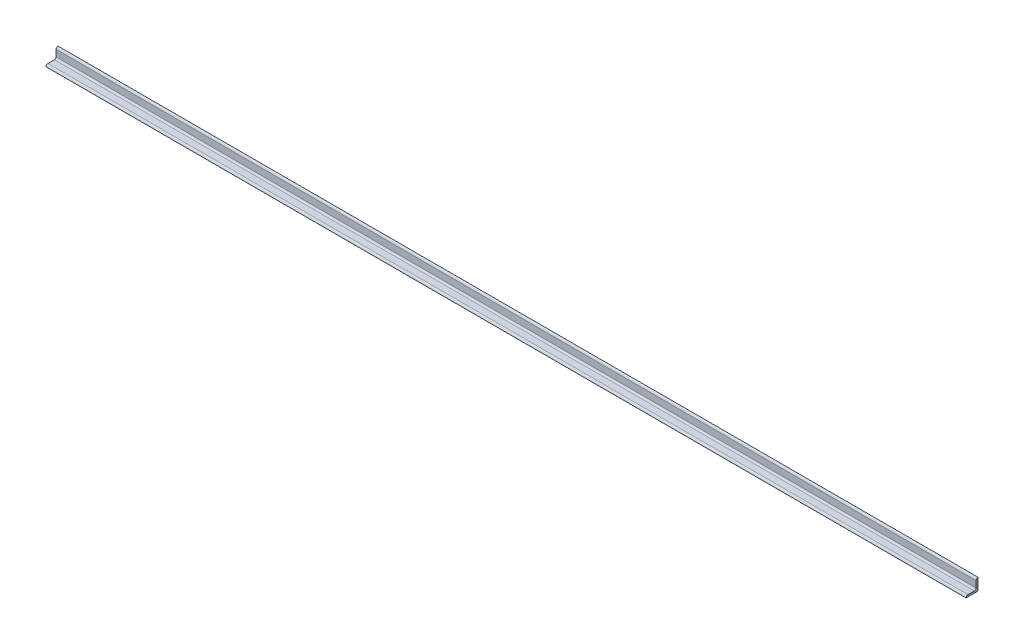
ISO-10303-21;
HEADER;
FILE_DESCRIPTION(('STEP AP214'),'2;1');
FILE_NAME('part.step','',(''),(''),'','','');
FILE_SCHEMA(('AUTOMOTIVE_DESIGN { 1 0 10303 214 1 1 1 1 }'));
ENDSEC;
DATA;
#1=APPLICATION_CONTEXT('core data for automotive mechanical design processes');
#2=APPLICATION_PROTOCOL_DEFINITION('international standard','automotive_design',2000,#1);
#3=PRODUCT_CONTEXT('',#1,'mechanical');
#4=PRODUCT('Part','Part','',(#3));
#5=PRODUCT_RELATED_PRODUCT_CATEGORY('part','',(#4));
#6=PRODUCT_DEFINITION_FORMATION('','',#4);
#7=PRODUCT_DEFINITION_CONTEXT('part definition',#1,'design');
#8=PRODUCT_DEFINITION('design','',#6,#7);
#9=PRODUCT_DEFINITION_SHAPE('','',#8);
#10=(LENGTH_UNIT() NAMED_UNIT(*) SI_UNIT(.MILLI.,.METRE.));
#11=(NAMED_UNIT(*) PLANE_ANGLE_UNIT() SI_UNIT($,.RADIAN.));
#12=(NAMED_UNIT(*) SI_UNIT($,.STERADIAN.) SOLID_ANGLE_UNIT());
#13=UNCERTAINTY_MEASURE_WITH_UNIT(LENGTH_MEASURE(1.E-05),#10,'distance_accuracy_value','');
#14=(GEOMETRIC_REPRESENTATION_CONTEXT(3) GLOBAL_UNCERTAINTY_ASSIGNED_CONTEXT((#13)) GLOBAL_UNIT_ASSIGNED_CONTEXT((#10,
#11,#12)) REPRESENTATION_CONTEXT('',''));
#15=CARTESIAN_POINT('',(0.,0.,0.));
#16=DIRECTION('',(0.,0.,1.));
#17=DIRECTION('',(1.,0.,0.));
#18=AXIS2_PLACEMENT_3D('',#15,#16,#17);
#19=CARTESIAN_POINT('',(960.,25.,0.));
#20=DIRECTION('',(0.,0.,1.));
#21=DIRECTION('',(1.,0.,0.));
#22=AXIS2_PLACEMENT_3D('',#19,#20,#21);
#23=PLANE('',#22);
#24=DIRECTION('',(0.,1.,0.));
#25=VECTOR('',#24,1.);
#26=CARTESIAN_POINT('',(-960.,25.,0.));
#27=LINE('',#26,#25);
#28=CARTESIAN_POINT('',(-960.,0.,0.));
#29=VERTEX_POINT('',#28);
#30=CARTESIAN_POINT('',(-960.,25.,0.));
#31=VERTEX_POINT('',#30);
#32=EDGE_CURVE('E149',#29,#31,#27,.T.);
#33=ORIENTED_EDGE('',*,*,#32,.T.);
#34=DIRECTION('',(-1.,0.,0.));
#35=VECTOR('',#34,1.);
#36=CARTESIAN_POINT('',(960.,25.,0.));
#37=LINE('',#36,#35);
#38=CARTESIAN_POINT('',(960.,25.,0.));
#39=VERTEX_POINT('',#38);
#40=EDGE_CURVE('E13',#39,#31,#37,.T.);
#41=ORIENTED_EDGE('',*,*,#40,.F.);
#42=DIRECTION('',(0.,1.,0.));
#43=VECTOR('',#42,1.);
#44=CARTESIAN_POINT('',(960.,25.,0.));
#45=LINE('',#44,#43);
#46=CARTESIAN_POINT('',(960.,0.,0.));
#47=VERTEX_POINT('',#46);
#48=EDGE_CURVE('E161',#47,#39,#45,.T.);
#49=ORIENTED_EDGE('',*,*,#48,.F.);
#50=DIRECTION('',(-1.,0.,0.));
#51=VECTOR('',#50,1.);
#52=CARTESIAN_POINT('',(960.,0.,0.));
#53=LINE('',#52,#51);
#54=EDGE_CURVE('E145',#47,#29,#53,.T.);
#55=ORIENTED_EDGE('',*,*,#54,.T.);
#56=EDGE_LOOP('',(#33,#41,#49,#55));
#57=FACE_BOUND('',#56,.T.);
#58=ADVANCED_FACE('F59',(#57),#23,.F.);
#59=CARTESIAN_POINT('',(960.,21.,0.));
#60=DIRECTION('',(-1.,0.,0.));
#61=DIRECTION('',(0.,0.,1.));
#62=AXIS2_PLACEMENT_3D('',#59,#60,#61);
#63=CYLINDRICAL_SURFACE('',#62,4.);
#64=CARTESIAN_POINT('',(-960.,21.,0.));
#65=DIRECTION('',(1.,0.,0.));
#66=DIRECTION('',(0.,0.,-1.));
#67=AXIS2_PLACEMENT_3D('',#64,#65,#66);
#68=CIRCLE('',#67,4.);
#69=CARTESIAN_POINT('',(-960.,21.,4.));
#70=VERTEX_POINT('',#69);
#71=EDGE_CURVE('E152',#31,#70,#68,.T.);
#72=ORIENTED_EDGE('',*,*,#71,.T.);
#73=DIRECTION('',(-1.,0.,0.));
#74=VECTOR('',#73,1.);
#75=CARTESIAN_POINT('',(960.,21.,4.));
#76=LINE('',#75,#74);
#77=CARTESIAN_POINT('',(960.,21.,4.));
#78=VERTEX_POINT('',#77);
#79=EDGE_CURVE('E67',#78,#70,#76,.T.);
#80=ORIENTED_EDGE('',*,*,#79,.F.);
#81=CARTESIAN_POINT('',(960.,21.,0.));
#82=DIRECTION('',(1.,0.,0.));
#83=DIRECTION('',(0.,0.,-1.));
#84=AXIS2_PLACEMENT_3D('',#81,#82,#83);
#85=CIRCLE('',#84,4.);
#86=EDGE_CURVE('E115',#39,#78,#85,.T.);
#87=ORIENTED_EDGE('',*,*,#86,.F.);
#88=ORIENTED_EDGE('',*,*,#40,.T.);
#89=EDGE_LOOP('',(#72,#80,#87,#88));
#90=FACE_BOUND('',#89,.T.);
#91=ADVANCED_FACE('F186',(#90),#63,.T.);
#92=CARTESIAN_POINT('',(960.,7.5,4.));
#93=DIRECTION('',(0.,0.,-1.));
#94=DIRECTION('',(0.,1.,0.));
#95=AXIS2_PLACEMENT_3D('',#92,#93,#94);
#96=PLANE('',#95);
#97=DIRECTION('',(0.,-1.,0.));
#98=VECTOR('',#97,1.);
#99=CARTESIAN_POINT('',(-960.,7.5,4.));
#100=LINE('',#99,#98);
#101=CARTESIAN_POINT('',(-960.,7.5,4.));
#102=VERTEX_POINT('',#101);
#103=EDGE_CURVE('E154',#70,#102,#100,.T.);
#104=ORIENTED_EDGE('',*,*,#103,.T.);
#105=DIRECTION('',(-1.,0.,0.));
#106=VECTOR('',#105,1.);
#107=CARTESIAN_POINT('',(960.,7.5,4.));
#108=LINE('',#107,#106);
#109=CARTESIAN_POINT('',(960.,7.5,4.));
#110=VERTEX_POINT('',#109);
#111=EDGE_CURVE('E165',#110,#102,#108,.T.);
#112=ORIENTED_EDGE('',*,*,#111,.F.);
#113=DIRECTION('',(0.,-1.,0.));
#114=VECTOR('',#113,1.);
#115=CARTESIAN_POINT('',(960.,7.5,4.));
#116=LINE('',#115,#114);
#117=EDGE_CURVE('E173',#78,#110,#116,.T.);
#118=ORIENTED_EDGE('',*,*,#117,.F.);
#119=ORIENTED_EDGE('',*,*,#79,.T.);
#120=EDGE_LOOP('',(#104,#112,#118,#119));
#121=FACE_BOUND('',#120,.T.);
#122=ADVANCED_FACE('F171',(#121),#96,.F.);
#123=CARTESIAN_POINT('',(960.,7.5,7.5));
#124=DIRECTION('',(-1.,0.,0.));
#125=DIRECTION('',(0.,0.,1.));
#126=AXIS2_PLACEMENT_3D('',#123,#124,#125);
#127=CYLINDRICAL_SURFACE('',#126,3.5);
#128=CARTESIAN_POINT('',(-960.,7.5,7.5));
#129=DIRECTION('',(-1.,0.,0.));
#130=DIRECTION('',(0.,0.,1.));
#131=AXIS2_PLACEMENT_3D('',#128,#129,#130);
#132=CIRCLE('',#131,3.5);
#133=CARTESIAN_POINT('',(-960.,4.,7.5));
#134=VERTEX_POINT('',#133);
#135=EDGE_CURVE('E156',#102,#134,#132,.T.);
#136=ORIENTED_EDGE('',*,*,#135,.T.);
#137=DIRECTION('',(-1.,0.,0.));
#138=VECTOR('',#137,1.);
#139=CARTESIAN_POINT('',(960.,4.,7.5));
#140=LINE('',#139,#138);
#141=CARTESIAN_POINT('',(960.,4.,7.5));
#142=VERTEX_POINT('',#141);
#143=EDGE_CURVE('E140',#142,#134,#140,.T.);
#144=ORIENTED_EDGE('',*,*,#143,.F.);
#145=CARTESIAN_POINT('',(960.,7.5,7.5));
#146=DIRECTION('',(-1.,0.,0.));
#147=DIRECTION('',(0.,0.,1.));
#148=AXIS2_PLACEMENT_3D('',#145,#146,#147);
#149=CIRCLE('',#148,3.5);
#150=EDGE_CURVE('E131',#110,#142,#149,.T.);
#151=ORIENTED_EDGE('',*,*,#150,.F.);
#152=ORIENTED_EDGE('',*,*,#111,.T.);
#153=EDGE_LOOP('',(#136,#144,#151,#152));
#154=FACE_BOUND('',#153,.T.);
#155=ADVANCED_FACE('F179',(#154),#127,.F.);
#156=CARTESIAN_POINT('',(960.,4.,21.));
#157=DIRECTION('',(0.,-1.,0.));
#158=DIRECTION('',(0.,0.,-1.));
#159=AXIS2_PLACEMENT_3D('',#156,#157,#158);
#160=PLANE('',#159);
#161=DIRECTION('',(0.,0.,1.));
#162=VECTOR('',#161,1.);
#163=CARTESIAN_POINT('',(-960.,4.,21.));
#164=LINE('',#163,#162);
#165=CARTESIAN_POINT('',(-960.,4.,21.));
#166=VERTEX_POINT('',#165);
#167=EDGE_CURVE('E139',#134,#166,#164,.T.);
#168=ORIENTED_EDGE('',*,*,#167,.T.);
#169=DIRECTION('',(-1.,0.,0.));
#170=VECTOR('',#169,1.);
#171=CARTESIAN_POINT('',(960.,4.,21.));
#172=LINE('',#171,#170);
#173=CARTESIAN_POINT('',(960.,4.,21.));
#174=VERTEX_POINT('',#173);
#175=EDGE_CURVE('E136',#174,#166,#172,.T.);
#176=ORIENTED_EDGE('',*,*,#175,.F.);
#177=DIRECTION('',(0.,0.,1.));
#178=VECTOR('',#177,1.);
#179=CARTESIAN_POINT('',(960.,4.,21.));
#180=LINE('',#179,#178);
#181=EDGE_CURVE('E125',#142,#174,#180,.T.);
#182=ORIENTED_EDGE('',*,*,#181,.F.);
#183=ORIENTED_EDGE('',*,*,#143,.T.);
#184=EDGE_LOOP('',(#168,#176,#182,#183));
#185=FACE_BOUND('',#184,.T.);
#186=ADVANCED_FACE('F137',(#185),#160,.F.);
#187=CARTESIAN_POINT('',(960.,0.,21.));
#188=DIRECTION('',(-1.,0.,0.));
#189=DIRECTION('',(0.,0.,1.));
#190=AXIS2_PLACEMENT_3D('',#187,#188,#189);
#191=CYLINDRICAL_SURFACE('',#190,4.);
#192=CARTESIAN_POINT('',(-960.,0.,21.));
#193=DIRECTION('',(1.,0.,0.));
#194=DIRECTION('',(0.,0.,1.));
#195=AXIS2_PLACEMENT_3D('',#192,#193,#194);
#196=CIRCLE('',#195,4.);
#197=CARTESIAN_POINT('',(-960.,0.,25.));
#198=VERTEX_POINT('',#197);
#199=EDGE_CURVE('E101',#166,#198,#196,.T.);
#200=ORIENTED_EDGE('',*,*,#199,.T.);
#201=DIRECTION('',(-1.,0.,0.));
#202=VECTOR('',#201,1.);
#203=CARTESIAN_POINT('',(960.,0.,25.));
#204=LINE('',#203,#202);
#205=CARTESIAN_POINT('',(960.,0.,25.));
#206=VERTEX_POINT('',#205);
#207=EDGE_CURVE('E141',#206,#198,#204,.T.);
#208=ORIENTED_EDGE('',*,*,#207,.F.);
#209=CARTESIAN_POINT('',(960.,0.,21.));
#210=DIRECTION('',(1.,0.,0.));
#211=DIRECTION('',(0.,0.,1.));
#212=AXIS2_PLACEMENT_3D('',#209,#210,#211);
#213=CIRCLE('',#212,4.);
#214=EDGE_CURVE('E129',#174,#206,#213,.T.);
#215=ORIENTED_EDGE('',*,*,#214,.F.);
#216=ORIENTED_EDGE('',*,*,#175,.T.);
#217=EDGE_LOOP('',(#200,#208,#215,#216));
#218=FACE_BOUND('',#217,.T.);
#219=ADVANCED_FACE('F143',(#218),#191,.T.);
#220=CARTESIAN_POINT('',(960.,0.,0.));
#221=DIRECTION('',(0.,1.,0.));
#222=DIRECTION('',(0.,0.,1.));
#223=AXIS2_PLACEMENT_3D('',#220,#221,#222);
#224=PLANE('',#223);
#225=DIRECTION('',(0.,0.,-1.));
#226=VECTOR('',#225,1.);
#227=CARTESIAN_POINT('',(-960.,0.,0.));
#228=LINE('',#227,#226);
#229=EDGE_CURVE('E107',#198,#29,#228,.T.);
#230=ORIENTED_EDGE('',*,*,#229,.T.);
#231=ORIENTED_EDGE('',*,*,#54,.F.);
#232=DIRECTION('',(0.,0.,-1.));
#233=VECTOR('',#232,1.);
#234=CARTESIAN_POINT('',(960.,0.,0.));
#235=LINE('',#234,#233);
#236=EDGE_CURVE('E75',#206,#47,#235,.T.);
#237=ORIENTED_EDGE('',*,*,#236,.F.);
#238=ORIENTED_EDGE('',*,*,#207,.T.);
#239=EDGE_LOOP('',(#230,#231,#237,#238));
#240=FACE_BOUND('',#239,.T.);
#241=ADVANCED_FACE('F200',(#240),#224,.F.);
#242=CARTESIAN_POINT('',(960.,0.,21.));
#243=DIRECTION('',(-1.,0.,0.));
#244=DIRECTION('',(0.,0.,1.));
#245=AXIS2_PLACEMENT_3D('',#242,#243,#244);
#246=PLANE('',#245);
#247=ORIENTED_EDGE('',*,*,#48,.T.);
#248=ORIENTED_EDGE('',*,*,#86,.T.);
#249=ORIENTED_EDGE('',*,*,#117,.T.);
#250=ORIENTED_EDGE('',*,*,#150,.T.);
#251=ORIENTED_EDGE('',*,*,#181,.T.);
#252=ORIENTED_EDGE('',*,*,#214,.T.);
#253=ORIENTED_EDGE('',*,*,#236,.T.);
#254=EDGE_LOOP('',(#247,#248,#249,#250,#251,#252,#253));
#255=FACE_BOUND('',#254,.T.);
#256=ADVANCED_FACE('F127',(#255),#246,.F.);
#257=CARTESIAN_POINT('',(-960.,0.,21.));
#258=DIRECTION('',(-1.,0.,0.));
#259=DIRECTION('',(0.,0.,1.));
#260=AXIS2_PLACEMENT_3D('',#257,#258,#259);
#261=PLANE('',#260);
#262=ORIENTED_EDGE('',*,*,#32,.F.);
#263=ORIENTED_EDGE('',*,*,#229,.F.);
#264=ORIENTED_EDGE('',*,*,#199,.F.);
#265=ORIENTED_EDGE('',*,*,#167,.F.);
#266=ORIENTED_EDGE('',*,*,#135,.F.);
#267=ORIENTED_EDGE('',*,*,#103,.F.);
#268=ORIENTED_EDGE('',*,*,#71,.F.);
#269=EDGE_LOOP('',(#262,#263,#264,#265,#266,#267,#268));
#270=FACE_BOUND('',#269,.T.);
#271=ADVANCED_FACE('F177',(#270),#261,.T.);
#272=CLOSED_SHELL('',(#58,#91,#122,#155,#186,#219,#241,#256,#271));
#273=MANIFOLD_SOLID_BREP('B2',#272);
#274=ADVANCED_BREP_SHAPE_REPRESENTATION('',(#18,#273),#14);
#275=SHAPE_DEFINITION_REPRESENTATION(#9,#274);
ENDSEC;
END-ISO-10303-21;
